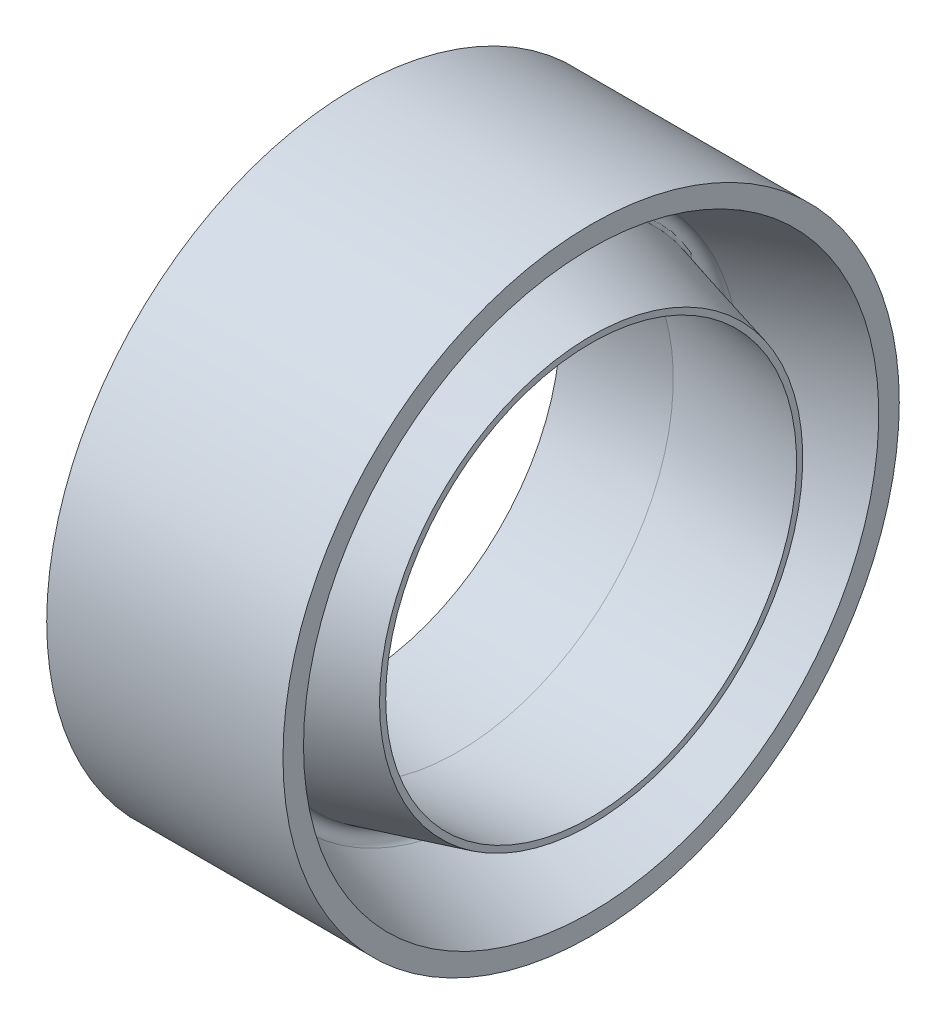
ISO-10303-21;
HEADER;
FILE_DESCRIPTION(('STEP AP214'),'2;1');
FILE_NAME('part.step','',(''),(''),'','','');
FILE_SCHEMA(('AUTOMOTIVE_DESIGN { 1 0 10303 214 1 1 1 1 }'));
ENDSEC;
DATA;
#1=APPLICATION_CONTEXT('core data for automotive mechanical design processes');
#2=APPLICATION_PROTOCOL_DEFINITION('international standard','automotive_design',2000,#1);
#3=PRODUCT_CONTEXT('',#1,'mechanical');
#4=PRODUCT('Part','Part','',(#3));
#5=PRODUCT_RELATED_PRODUCT_CATEGORY('part','',(#4));
#6=PRODUCT_DEFINITION_FORMATION('','',#4);
#7=PRODUCT_DEFINITION_CONTEXT('part definition',#1,'design');
#8=PRODUCT_DEFINITION('design','',#6,#7);
#9=PRODUCT_DEFINITION_SHAPE('','',#8);
#10=(LENGTH_UNIT() NAMED_UNIT(*) SI_UNIT(.MILLI.,.METRE.));
#11=(NAMED_UNIT(*) PLANE_ANGLE_UNIT() SI_UNIT($,.RADIAN.));
#12=(NAMED_UNIT(*) SI_UNIT($,.STERADIAN.) SOLID_ANGLE_UNIT());
#13=UNCERTAINTY_MEASURE_WITH_UNIT(LENGTH_MEASURE(1.E-05),#10,'distance_accuracy_value','');
#14=(GEOMETRIC_REPRESENTATION_CONTEXT(3) GLOBAL_UNCERTAINTY_ASSIGNED_CONTEXT((#13)) GLOBAL_UNIT_ASSIGNED_CONTEXT((#10,
#11,#12)) REPRESENTATION_CONTEXT('',''));
#15=CARTESIAN_POINT('',(0.,0.,0.));
#16=DIRECTION('',(0.,0.,1.));
#17=DIRECTION('',(1.,0.,0.));
#18=AXIS2_PLACEMENT_3D('',#15,#16,#17);
#19=CARTESIAN_POINT('',(-30.5,14.3425085559938,0.));
#20=DIRECTION('',(-1.,0.,0.));
#21=DIRECTION('',(0.,0.,1.));
#22=AXIS2_PLACEMENT_3D('',#19,#20,#21);
#23=PLANE('',#22);
#24=CARTESIAN_POINT('',(-30.5,0.342508555993832,0.));
#25=DIRECTION('',(-1.,0.,0.));
#26=DIRECTION('',(0.,0.,1.));
#27=AXIS2_PLACEMENT_3D('',#24,#25,#26);
#28=CIRCLE('',#27,15.);
#29=CARTESIAN_POINT('',(-30.5,0.342508555993832,15.));
#30=VERTEX_POINT('',#29);
#31=EDGE_CURVE('E76',#30,#30,#28,.T.);
#32=ORIENTED_EDGE('',*,*,#31,.F.);
#33=EDGE_LOOP('',(#32));
#34=FACE_BOUND('',#33,.T.);
#35=CARTESIAN_POINT('',(-30.5,0.342508555993832,0.));
#36=DIRECTION('',(-1.,0.,0.));
#37=DIRECTION('',(0.,0.,1.));
#38=AXIS2_PLACEMENT_3D('',#35,#36,#37);
#39=CIRCLE('',#38,14.);
#40=CARTESIAN_POINT('',(-30.5,0.342508555993832,14.));
#41=VERTEX_POINT('',#40);
#42=EDGE_CURVE('E10',#41,#41,#39,.T.);
#43=ORIENTED_EDGE('',*,*,#42,.T.);
#44=EDGE_LOOP('',(#43));
#45=FACE_BOUND('',#44,.T.);
#46=ADVANCED_FACE('F33',(#34,#45),#23,.F.);
#47=CARTESIAN_POINT('',(-35.6560812511821,0.342508555993832,0.));
#48=DIRECTION('',(1.,0.,0.));
#49=DIRECTION('',(0.,0.,-1.));
#50=AXIS2_PLACEMENT_3D('',#47,#48,#49);
#51=CONICAL_SURFACE('',#50,12.4135134611747,0.298498931586181);
#52=ORIENTED_EDGE('',*,*,#42,.F.);
#53=EDGE_LOOP('',(#52));
#54=FACE_BOUND('',#53,.T.);
#55=CARTESIAN_POINT('',(-35.6560812511821,0.342508555993832,0.));
#56=DIRECTION('',(-1.,0.,0.));
#57=DIRECTION('',(0.,0.,1.));
#58=AXIS2_PLACEMENT_3D('',#55,#56,#57);
#59=CIRCLE('',#58,12.4135134611747);
#60=CARTESIAN_POINT('',(-35.6560812511821,0.342508555993832,12.4135134611747));
#61=VERTEX_POINT('',#60);
#62=EDGE_CURVE('E39',#61,#61,#59,.T.);
#63=ORIENTED_EDGE('',*,*,#62,.T.);
#64=EDGE_LOOP('',(#63));
#65=FACE_BOUND('',#64,.T.);
#66=ADVANCED_FACE('F83',(#54,#65),#51,.F.);
#67=CARTESIAN_POINT('',(-35.5384469116471,0.342508555993831,0.));
#68=DIRECTION('',(-1.,0.,0.));
#69=DIRECTION('',(0.,0.,1.));
#70=AXIS2_PLACEMENT_3D('',#67,#68,#69);
#71=TOROIDAL_SURFACE('',#70,12.0312018576859,0.399999999999996);
#72=ORIENTED_EDGE('',*,*,#62,.F.);
#73=EDGE_LOOP('',(#72));
#74=FACE_BOUND('',#73,.T.);
#75=CARTESIAN_POINT('',(-35.6396580094045,0.342508555993832,0.));
#76=DIRECTION('',(-1.,0.,0.));
#77=DIRECTION('',(0.,0.,1.));
#78=AXIS2_PLACEMENT_3D('',#75,#76,#77);
#79=CIRCLE('',#78,11.6442182486135);
#80=CARTESIAN_POINT('',(-35.6396580094045,0.342508555993832,11.6442182486135));
#81=VERTEX_POINT('',#80);
#82=EDGE_CURVE('E43',#81,#81,#79,.T.);
#83=ORIENTED_EDGE('',*,*,#82,.T.);
#84=EDGE_LOOP('',(#83));
#85=FACE_BOUND('',#84,.T.);
#86=ADVANCED_FACE('F87',(#74,#85),#71,.F.);
#87=CARTESIAN_POINT('',(-30.5,0.342508555993832,0.));
#88=DIRECTION('',(-1.,0.,0.));
#89=DIRECTION('',(0.,0.,1.));
#90=AXIS2_PLACEMENT_3D('',#87,#88,#89);
#91=CONICAL_SURFACE('',#90,10.3,0.255808564615373);
#92=ORIENTED_EDGE('',*,*,#82,.F.);
#93=EDGE_LOOP('',(#92));
#94=FACE_BOUND('',#93,.T.);
#95=CARTESIAN_POINT('',(-30.5,0.342508555993832,0.));
#96=DIRECTION('',(-1.,0.,0.));
#97=DIRECTION('',(0.,0.,1.));
#98=AXIS2_PLACEMENT_3D('',#95,#96,#97);
#99=CIRCLE('',#98,10.3);
#100=CARTESIAN_POINT('',(-30.5,0.342508555993832,10.3));
#101=VERTEX_POINT('',#100);
#102=EDGE_CURVE('E47',#101,#101,#99,.T.);
#103=ORIENTED_EDGE('',*,*,#102,.T.);
#104=EDGE_LOOP('',(#103));
#105=FACE_BOUND('',#104,.T.);
#106=ADVANCED_FACE('F92',(#94,#105),#91,.T.);
#107=CARTESIAN_POINT('',(-30.5,10.3425085559938,0.));
#108=DIRECTION('',(-1.,0.,0.));
#109=DIRECTION('',(0.,0.,1.));
#110=AXIS2_PLACEMENT_3D('',#107,#108,#109);
#111=PLANE('',#110);
#112=ORIENTED_EDGE('',*,*,#102,.F.);
#113=EDGE_LOOP('',(#112));
#114=FACE_BOUND('',#113,.T.);
#115=CARTESIAN_POINT('',(-30.5,0.342508555993832,0.));
#116=DIRECTION('',(-1.,0.,0.));
#117=DIRECTION('',(0.,0.,1.));
#118=AXIS2_PLACEMENT_3D('',#115,#116,#117);
#119=CIRCLE('',#118,10.);
#120=CARTESIAN_POINT('',(-30.5,0.342508555993832,10.));
#121=VERTEX_POINT('',#120);
#122=EDGE_CURVE('E52',#121,#121,#119,.T.);
#123=ORIENTED_EDGE('',*,*,#122,.T.);
#124=EDGE_LOOP('',(#123));
#125=FACE_BOUND('',#124,.T.);
#126=ADVANCED_FACE('F98',(#114,#125),#111,.F.);
#127=CARTESIAN_POINT('',(-37.,0.342508555993832,0.));
#128=DIRECTION('',(-1.,0.,0.));
#129=DIRECTION('',(0.,0.,1.));
#130=AXIS2_PLACEMENT_3D('',#127,#128,#129);
#131=CONICAL_SURFACE('',#130,10.5,0.0767718912697784);
#132=ORIENTED_EDGE('',*,*,#122,.F.);
#133=EDGE_LOOP('',(#132));
#134=FACE_BOUND('',#133,.T.);
#135=CARTESIAN_POINT('',(-37.,0.342508555993832,0.));
#136=DIRECTION('',(-1.,0.,0.));
#137=DIRECTION('',(0.,0.,1.));
#138=AXIS2_PLACEMENT_3D('',#135,#136,#137);
#139=CIRCLE('',#138,10.5);
#140=CARTESIAN_POINT('',(-37.,0.342508555993832,10.5));
#141=VERTEX_POINT('',#140);
#142=EDGE_CURVE('E55',#141,#141,#139,.T.);
#143=ORIENTED_EDGE('',*,*,#142,.T.);
#144=EDGE_LOOP('',(#143));
#145=FACE_BOUND('',#144,.T.);
#146=ADVANCED_FACE('F102',(#134,#145),#131,.F.);
#147=CARTESIAN_POINT('',(-42.,0.342508555993832,0.));
#148=DIRECTION('',(1.,0.,0.));
#149=DIRECTION('',(0.,0.,-1.));
#150=AXIS2_PLACEMENT_3D('',#147,#148,#149);
#151=CONICAL_SURFACE('',#150,10.,0.0996686524911611);
#152=ORIENTED_EDGE('',*,*,#142,.F.);
#153=EDGE_LOOP('',(#152));
#154=FACE_BOUND('',#153,.T.);
#155=CARTESIAN_POINT('',(-42.,0.342508555993832,0.));
#156=DIRECTION('',(-1.,0.,0.));
#157=DIRECTION('',(0.,0.,1.));
#158=AXIS2_PLACEMENT_3D('',#155,#156,#157);
#159=CIRCLE('',#158,10.);
#160=CARTESIAN_POINT('',(-42.,0.342508555993832,10.));
#161=VERTEX_POINT('',#160);
#162=EDGE_CURVE('E58',#161,#161,#159,.T.);
#163=ORIENTED_EDGE('',*,*,#162,.T.);
#164=EDGE_LOOP('',(#163));
#165=FACE_BOUND('',#164,.T.);
#166=ADVANCED_FACE('F106',(#154,#165),#151,.F.);
#167=CARTESIAN_POINT('',(-42.,10.6425085559938,0.));
#168=DIRECTION('',(1.,0.,0.));
#169=DIRECTION('',(0.,0.,-1.));
#170=AXIS2_PLACEMENT_3D('',#167,#168,#169);
#171=PLANE('',#170);
#172=ORIENTED_EDGE('',*,*,#162,.F.);
#173=EDGE_LOOP('',(#172));
#174=FACE_BOUND('',#173,.T.);
#175=CARTESIAN_POINT('',(-42.,0.342508555993832,0.));
#176=DIRECTION('',(-1.,0.,0.));
#177=DIRECTION('',(0.,0.,1.));
#178=AXIS2_PLACEMENT_3D('',#175,#176,#177);
#179=CIRCLE('',#178,10.3);
#180=CARTESIAN_POINT('',(-42.,0.342508555993832,10.3));
#181=VERTEX_POINT('',#180);
#182=EDGE_CURVE('E61',#181,#181,#179,.T.);
#183=ORIENTED_EDGE('',*,*,#182,.T.);
#184=EDGE_LOOP('',(#183));
#185=FACE_BOUND('',#184,.T.);
#186=ADVANCED_FACE('F110',(#174,#185),#171,.F.);
#187=CARTESIAN_POINT('',(-39.3163544473517,0.342508555993832,0.));
#188=DIRECTION('',(1.,0.,0.));
#189=DIRECTION('',(0.,0.,-1.));
#190=AXIS2_PLACEMENT_3D('',#187,#188,#189);
#191=CONICAL_SURFACE('',#190,11.3063670822431,0.358770670270574);
#192=ORIENTED_EDGE('',*,*,#182,.F.);
#193=EDGE_LOOP('',(#192));
#194=FACE_BOUND('',#193,.T.);
#195=CARTESIAN_POINT('',(-39.3163544473517,0.342508555993832,0.));
#196=DIRECTION('',(-1.,0.,0.));
#197=DIRECTION('',(0.,0.,1.));
#198=AXIS2_PLACEMENT_3D('',#195,#196,#197);
#199=CIRCLE('',#198,11.3063670822431);
#200=CARTESIAN_POINT('',(-39.3163544473517,0.342508555993832,11.3063670822431));
#201=VERTEX_POINT('',#200);
#202=EDGE_CURVE('E64',#201,#201,#199,.T.);
#203=ORIENTED_EDGE('',*,*,#202,.T.);
#204=EDGE_LOOP('',(#203));
#205=FACE_BOUND('',#204,.T.);
#206=ADVANCED_FACE('F114',(#194,#205),#191,.T.);
#207=CARTESIAN_POINT('',(-39.3514667915106,0.342508555993831,0.));
#208=DIRECTION('',(-1.,0.,0.));
#209=DIRECTION('',(0.,0.,1.));
#210=AXIS2_PLACEMENT_3D('',#207,#208,#209);
#211=TOROIDAL_SURFACE('',#210,11.4,0.0999999999999996);
#212=ORIENTED_EDGE('',*,*,#202,.F.);
#213=EDGE_LOOP('',(#212));
#214=FACE_BOUND('',#213,.T.);
#215=CARTESIAN_POINT('',(-39.3514667915106,0.342508555993832,0.));
#216=DIRECTION('',(-1.,0.,0.));
#217=DIRECTION('',(0.,0.,1.));
#218=AXIS2_PLACEMENT_3D('',#215,#216,#217);
#219=CIRCLE('',#218,11.5);
#220=CARTESIAN_POINT('',(-39.3514667915106,0.342508555993832,11.5));
#221=VERTEX_POINT('',#220);
#222=EDGE_CURVE('E67',#221,#221,#219,.T.);
#223=ORIENTED_EDGE('',*,*,#222,.T.);
#224=EDGE_LOOP('',(#223));
#225=FACE_BOUND('',#224,.T.);
#226=ADVANCED_FACE('F118',(#214,#225),#211,.F.);
#227=CARTESIAN_POINT('',(-61.483966901383,0.342508555993832,0.));
#228=DIRECTION('',(-1.,0.,0.));
#229=DIRECTION('',(0.,0.,1.));
#230=AXIS2_PLACEMENT_3D('',#227,#228,#229);
#231=CYLINDRICAL_SURFACE('',#230,11.5);
#232=ORIENTED_EDGE('',*,*,#222,.F.);
#233=EDGE_LOOP('',(#232));
#234=FACE_BOUND('',#233,.T.);
#235=CARTESIAN_POINT('',(-42.,0.342508555993832,0.));
#236=DIRECTION('',(-1.,0.,0.));
#237=DIRECTION('',(0.,0.,1.));
#238=AXIS2_PLACEMENT_3D('',#235,#236,#237);
#239=CIRCLE('',#238,11.5);
#240=CARTESIAN_POINT('',(-42.,0.342508555993832,11.5));
#241=VERTEX_POINT('',#240);
#242=EDGE_CURVE('E70',#241,#241,#239,.T.);
#243=ORIENTED_EDGE('',*,*,#242,.T.);
#244=EDGE_LOOP('',(#243));
#245=FACE_BOUND('',#244,.T.);
#246=ADVANCED_FACE('F122',(#234,#245),#231,.F.);
#247=CARTESIAN_POINT('',(-42.,15.3425085559938,0.));
#248=DIRECTION('',(1.,0.,0.));
#249=DIRECTION('',(0.,0.,-1.));
#250=AXIS2_PLACEMENT_3D('',#247,#248,#249);
#251=PLANE('',#250);
#252=ORIENTED_EDGE('',*,*,#242,.F.);
#253=EDGE_LOOP('',(#252));
#254=FACE_BOUND('',#253,.T.);
#255=CARTESIAN_POINT('',(-42.,0.342508555993832,0.));
#256=DIRECTION('',(-1.,0.,0.));
#257=DIRECTION('',(0.,0.,1.));
#258=AXIS2_PLACEMENT_3D('',#255,#256,#257);
#259=CIRCLE('',#258,15.);
#260=CARTESIAN_POINT('',(-42.,0.342508555993832,15.));
#261=VERTEX_POINT('',#260);
#262=EDGE_CURVE('E73',#261,#261,#259,.T.);
#263=ORIENTED_EDGE('',*,*,#262,.T.);
#264=EDGE_LOOP('',(#263));
#265=FACE_BOUND('',#264,.T.);
#266=ADVANCED_FACE('F126',(#254,#265),#251,.F.);
#267=CARTESIAN_POINT('',(-61.483966901383,0.342508555993832,0.));
#268=DIRECTION('',(-1.,0.,0.));
#269=DIRECTION('',(0.,0.,1.));
#270=AXIS2_PLACEMENT_3D('',#267,#268,#269);
#271=CYLINDRICAL_SURFACE('',#270,15.);
#272=ORIENTED_EDGE('',*,*,#262,.F.);
#273=EDGE_LOOP('',(#272));
#274=FACE_BOUND('',#273,.T.);
#275=ORIENTED_EDGE('',*,*,#31,.T.);
#276=EDGE_LOOP('',(#275));
#277=FACE_BOUND('',#276,.T.);
#278=ADVANCED_FACE('F80',(#274,#277),#271,.T.);
#279=CLOSED_SHELL('',(#46,#66,#86,#106,#126,#146,#166,#186,#206,#226,#246,#266,#278));
#280=MANIFOLD_SOLID_BREP('B2',#279);
#281=ADVANCED_BREP_SHAPE_REPRESENTATION('',(#18,#280),#14);
#282=SHAPE_DEFINITION_REPRESENTATION(#9,#281);
ENDSEC;
END-ISO-10303-21;
